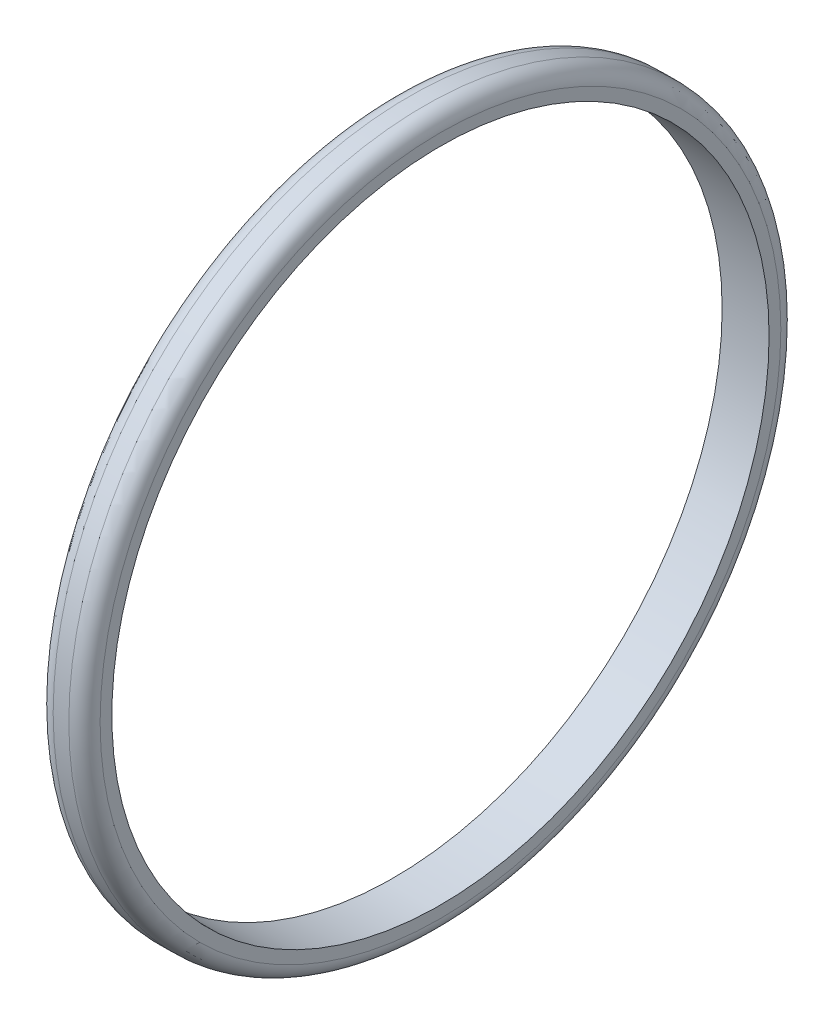
ISO-10303-21;
HEADER;
FILE_DESCRIPTION(('STEP AP214'),'2;1');
FILE_NAME('part.step','',(''),(''),'','','');
FILE_SCHEMA(('AUTOMOTIVE_DESIGN { 1 0 10303 214 1 1 1 1 }'));
ENDSEC;
DATA;
#1=APPLICATION_CONTEXT('core data for automotive mechanical design processes');
#2=APPLICATION_PROTOCOL_DEFINITION('international standard','automotive_design',2000,#1);
#3=PRODUCT_CONTEXT('',#1,'mechanical');
#4=PRODUCT('Part','Part','',(#3));
#5=PRODUCT_RELATED_PRODUCT_CATEGORY('part','',(#4));
#6=PRODUCT_DEFINITION_FORMATION('','',#4);
#7=PRODUCT_DEFINITION_CONTEXT('part definition',#1,'design');
#8=PRODUCT_DEFINITION('design','',#6,#7);
#9=PRODUCT_DEFINITION_SHAPE('','',#8);
#10=(LENGTH_UNIT() NAMED_UNIT(*) SI_UNIT(.MILLI.,.METRE.));
#11=(NAMED_UNIT(*) PLANE_ANGLE_UNIT() SI_UNIT($,.RADIAN.));
#12=(NAMED_UNIT(*) SI_UNIT($,.STERADIAN.) SOLID_ANGLE_UNIT());
#13=UNCERTAINTY_MEASURE_WITH_UNIT(LENGTH_MEASURE(1.E-05),#10,'distance_accuracy_value','');
#14=(GEOMETRIC_REPRESENTATION_CONTEXT(3) GLOBAL_UNCERTAINTY_ASSIGNED_CONTEXT((#13)) GLOBAL_UNIT_ASSIGNED_CONTEXT((#10,
#11,#12)) REPRESENTATION_CONTEXT('',''));
#15=CARTESIAN_POINT('',(0.,0.,0.));
#16=DIRECTION('',(0.,0.,1.));
#17=DIRECTION('',(1.,0.,0.));
#18=AXIS2_PLACEMENT_3D('',#15,#16,#17);
#19=CARTESIAN_POINT('',(6.,0.,0.));
#20=DIRECTION('',(1.,0.,0.));
#21=DIRECTION('',(0.,0.,-1.));
#22=AXIS2_PLACEMENT_3D('',#19,#20,#21);
#23=PLANE('',#22);
#24=CARTESIAN_POINT('',(6.,0.,0.));
#25=DIRECTION('',(1.,0.,0.));
#26=DIRECTION('',(0.,0.,-1.));
#27=AXIS2_PLACEMENT_3D('',#24,#25,#26);
#28=CIRCLE('',#27,43.5);
#29=CARTESIAN_POINT('',(6.,0.,-43.5));
#30=VERTEX_POINT('',#29);
#31=EDGE_CURVE('E10',#30,#30,#28,.T.);
#32=ORIENTED_EDGE('',*,*,#31,.T.);
#33=EDGE_LOOP('',(#32));
#34=FACE_BOUND('',#33,.T.);
#35=CARTESIAN_POINT('',(6.,0.,0.));
#36=DIRECTION('',(1.,0.,0.));
#37=DIRECTION('',(0.,0.,-1.));
#38=AXIS2_PLACEMENT_3D('',#35,#36,#37);
#39=CIRCLE('',#38,42.);
#40=CARTESIAN_POINT('',(6.,0.,-42.));
#41=VERTEX_POINT('',#40);
#42=EDGE_CURVE('E65',#41,#41,#39,.T.);
#43=ORIENTED_EDGE('',*,*,#42,.F.);
#44=EDGE_LOOP('',(#43));
#45=FACE_BOUND('',#44,.T.);
#46=ADVANCED_FACE('F41',(#34,#45),#23,.T.);
#47=CARTESIAN_POINT('',(0.,0.,0.));
#48=DIRECTION('',(1.,0.,0.));
#49=DIRECTION('',(0.,0.,-1.));
#50=AXIS2_PLACEMENT_3D('',#47,#48,#49);
#51=PLANE('',#50);
#52=CARTESIAN_POINT('',(0.,0.,0.));
#53=DIRECTION('',(1.,0.,0.));
#54=DIRECTION('',(0.,0.,-1.));
#55=AXIS2_PLACEMENT_3D('',#52,#53,#54);
#56=CIRCLE('',#55,43.5);
#57=CARTESIAN_POINT('',(0.,0.,-43.5));
#58=VERTEX_POINT('',#57);
#59=EDGE_CURVE('E49',#58,#58,#56,.F.);
#60=ORIENTED_EDGE('',*,*,#59,.T.);
#61=EDGE_LOOP('',(#60));
#62=FACE_BOUND('',#61,.T.);
#63=CARTESIAN_POINT('',(0.,0.,0.));
#64=DIRECTION('',(1.,0.,0.));
#65=DIRECTION('',(0.,0.,-1.));
#66=AXIS2_PLACEMENT_3D('',#63,#64,#65);
#67=CIRCLE('',#66,42.);
#68=CARTESIAN_POINT('',(0.,0.,-42.));
#69=VERTEX_POINT('',#68);
#70=EDGE_CURVE('E66',#69,#69,#67,.T.);
#71=ORIENTED_EDGE('',*,*,#70,.T.);
#72=EDGE_LOOP('',(#71));
#73=FACE_BOUND('',#72,.T.);
#74=ADVANCED_FACE('F78',(#62,#73),#51,.F.);
#75=CARTESIAN_POINT('',(6.,0.,0.));
#76=DIRECTION('',(-1.,0.,0.));
#77=DIRECTION('',(0.,0.,1.));
#78=AXIS2_PLACEMENT_3D('',#75,#76,#77);
#79=CYLINDRICAL_SURFACE('',#78,45.5);
#80=CARTESIAN_POINT('',(2.,0.,0.));
#81=DIRECTION('',(1.,0.,0.));
#82=DIRECTION('',(0.,0.,-1.));
#83=AXIS2_PLACEMENT_3D('',#80,#81,#82);
#84=CIRCLE('',#83,45.5);
#85=CARTESIAN_POINT('',(2.,0.,-45.5));
#86=VERTEX_POINT('',#85);
#87=EDGE_CURVE('E54',#86,#86,#84,.T.);
#88=ORIENTED_EDGE('',*,*,#87,.T.);
#89=EDGE_LOOP('',(#88));
#90=FACE_BOUND('',#89,.T.);
#91=CARTESIAN_POINT('',(4.,0.,0.));
#92=DIRECTION('',(1.,0.,0.));
#93=DIRECTION('',(0.,0.,-1.));
#94=AXIS2_PLACEMENT_3D('',#91,#92,#93);
#95=CIRCLE('',#94,45.5);
#96=CARTESIAN_POINT('',(4.,0.,-45.5));
#97=VERTEX_POINT('',#96);
#98=EDGE_CURVE('E59',#97,#97,#95,.F.);
#99=ORIENTED_EDGE('',*,*,#98,.T.);
#100=EDGE_LOOP('',(#99));
#101=FACE_BOUND('',#100,.T.);
#102=ADVANCED_FACE('F83',(#90,#101),#79,.T.);
#103=CARTESIAN_POINT('',(6.,0.,0.));
#104=DIRECTION('',(-1.,0.,0.));
#105=DIRECTION('',(0.,0.,1.));
#106=AXIS2_PLACEMENT_3D('',#103,#104,#105);
#107=CYLINDRICAL_SURFACE('',#106,42.);
#108=ORIENTED_EDGE('',*,*,#42,.T.);
#109=EDGE_LOOP('',(#108));
#110=FACE_BOUND('',#109,.T.);
#111=ORIENTED_EDGE('',*,*,#70,.F.);
#112=EDGE_LOOP('',(#111));
#113=FACE_BOUND('',#112,.T.);
#114=ADVANCED_FACE('F74',(#110,#113),#107,.F.);
#115=CARTESIAN_POINT('',(2.,0.,0.));
#116=DIRECTION('',(1.,0.,0.));
#117=DIRECTION('',(0.,0.,-1.));
#118=AXIS2_PLACEMENT_3D('',#115,#116,#117);
#119=TOROIDAL_SURFACE('',#118,43.5,2.);
#120=ORIENTED_EDGE('',*,*,#59,.F.);
#121=EDGE_LOOP('',(#120));
#122=FACE_BOUND('',#121,.T.);
#123=ORIENTED_EDGE('',*,*,#87,.F.);
#124=EDGE_LOOP('',(#123));
#125=FACE_BOUND('',#124,.T.);
#126=ADVANCED_FACE('F89',(#122,#125),#119,.T.);
#127=CARTESIAN_POINT('',(4.,0.,0.));
#128=DIRECTION('',(1.,0.,0.));
#129=DIRECTION('',(0.,0.,-1.));
#130=AXIS2_PLACEMENT_3D('',#127,#128,#129);
#131=TOROIDAL_SURFACE('',#130,43.5,2.);
#132=ORIENTED_EDGE('',*,*,#98,.F.);
#133=EDGE_LOOP('',(#132));
#134=FACE_BOUND('',#133,.T.);
#135=ORIENTED_EDGE('',*,*,#31,.F.);
#136=EDGE_LOOP('',(#135));
#137=FACE_BOUND('',#136,.T.);
#138=ADVANCED_FACE('F43',(#134,#137),#131,.T.);
#139=CLOSED_SHELL('',(#46,#74,#102,#114,#126,#138));
#140=MANIFOLD_SOLID_BREP('B2',#139);
#141=ADVANCED_BREP_SHAPE_REPRESENTATION('',(#18,#140),#14);
#142=SHAPE_DEFINITION_REPRESENTATION(#9,#141);
ENDSEC;
END-ISO-10303-21;
